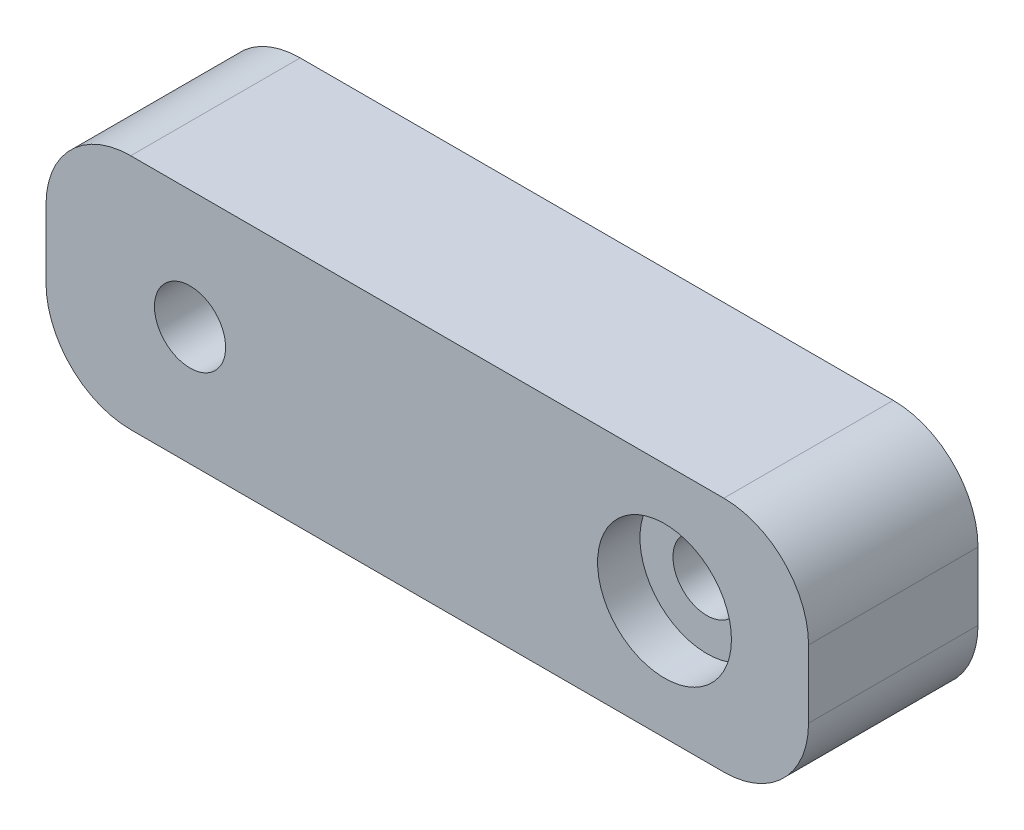
ISO-10303-21;
HEADER;
FILE_DESCRIPTION(('STEP AP214'),'2;1');
FILE_NAME('part.step','',(''),(''),'','','');
FILE_SCHEMA(('AUTOMOTIVE_DESIGN { 1 0 10303 214 1 1 1 1 }'));
ENDSEC;
DATA;
#1=APPLICATION_CONTEXT('core data for automotive mechanical design processes');
#2=APPLICATION_PROTOCOL_DEFINITION('international standard','automotive_design',2000,#1);
#3=PRODUCT_CONTEXT('',#1,'mechanical');
#4=PRODUCT('Part','Part','',(#3));
#5=PRODUCT_RELATED_PRODUCT_CATEGORY('part','',(#4));
#6=PRODUCT_DEFINITION_FORMATION('','',#4);
#7=PRODUCT_DEFINITION_CONTEXT('part definition',#1,'design');
#8=PRODUCT_DEFINITION('design','',#6,#7);
#9=PRODUCT_DEFINITION_SHAPE('','',#8);
#10=(LENGTH_UNIT() NAMED_UNIT(*) SI_UNIT(.MILLI.,.METRE.));
#11=(NAMED_UNIT(*) PLANE_ANGLE_UNIT() SI_UNIT($,.RADIAN.));
#12=(NAMED_UNIT(*) SI_UNIT($,.STERADIAN.) SOLID_ANGLE_UNIT());
#13=UNCERTAINTY_MEASURE_WITH_UNIT(LENGTH_MEASURE(1.E-05),#10,'distance_accuracy_value','');
#14=(GEOMETRIC_REPRESENTATION_CONTEXT(3) GLOBAL_UNCERTAINTY_ASSIGNED_CONTEXT((#13)) GLOBAL_UNIT_ASSIGNED_CONTEXT((#10,
#11,#12)) REPRESENTATION_CONTEXT('',''));
#15=CARTESIAN_POINT('',(0.,0.,0.));
#16=DIRECTION('',(0.,0.,1.));
#17=DIRECTION('',(1.,0.,0.));
#18=AXIS2_PLACEMENT_3D('',#15,#16,#17);
#19=CARTESIAN_POINT('',(-59.3506182432433,20.3019459459459,10.));
#20=DIRECTION('',(1.,0.,0.));
#21=DIRECTION('',(0.,0.,-1.));
#22=AXIS2_PLACEMENT_3D('',#19,#20,#21);
#23=PLANE('',#22);
#24=DIRECTION('',(0.,-1.,0.));
#25=VECTOR('',#24,1.);
#26=CARTESIAN_POINT('',(-59.3506182432433,20.3019459459459,0.));
#27=LINE('',#26,#25);
#28=CARTESIAN_POINT('',(-59.3506182432433,15.3019459459459,0.));
#29=VERTEX_POINT('',#28);
#30=CARTESIAN_POINT('',(-59.3506182432433,11.3019459459459,0.));
#31=VERTEX_POINT('',#30);
#32=EDGE_CURVE('E217',#29,#31,#27,.T.);
#33=ORIENTED_EDGE('',*,*,#32,.T.);
#34=DIRECTION('',(0.,0.,-1.));
#35=VECTOR('',#34,1.);
#36=CARTESIAN_POINT('',(-59.3506182432433,11.3019459459459,10.));
#37=LINE('',#36,#35);
#38=CARTESIAN_POINT('',(-59.3506182432433,11.3019459459459,10.));
#39=VERTEX_POINT('',#38);
#40=EDGE_CURVE('E11',#31,#39,#37,.F.);
#41=ORIENTED_EDGE('',*,*,#40,.T.);
#42=DIRECTION('',(0.,-1.,0.));
#43=VECTOR('',#42,1.);
#44=CARTESIAN_POINT('',(-59.3506182432433,20.3019459459459,10.));
#45=LINE('',#44,#43);
#46=CARTESIAN_POINT('',(-59.3506182432433,15.3019459459459,10.));
#47=VERTEX_POINT('',#46);
#48=EDGE_CURVE('E225',#47,#39,#45,.T.);
#49=ORIENTED_EDGE('',*,*,#48,.F.);
#50=DIRECTION('',(0.,0.,-1.));
#51=VECTOR('',#50,1.);
#52=CARTESIAN_POINT('',(-59.3506182432433,15.3019459459459,0.));
#53=LINE('',#52,#51);
#54=EDGE_CURVE('E234',#47,#29,#53,.T.);
#55=ORIENTED_EDGE('',*,*,#54,.T.);
#56=EDGE_LOOP('',(#33,#41,#49,#55));
#57=FACE_BOUND('',#56,.T.);
#58=ADVANCED_FACE('F43',(#57),#23,.F.);
#59=CARTESIAN_POINT('',(-59.3506182432433,6.30194594594594,10.));
#60=DIRECTION('',(0.,1.,0.));
#61=DIRECTION('',(0.,0.,1.));
#62=AXIS2_PLACEMENT_3D('',#59,#60,#61);
#63=PLANE('',#62);
#64=DIRECTION('',(1.,0.,0.));
#65=VECTOR('',#64,1.);
#66=CARTESIAN_POINT('',(-59.3506182432433,6.30194594594594,0.));
#67=LINE('',#66,#65);
#68=CARTESIAN_POINT('',(-54.3506182432433,6.30194594594594,0.));
#69=VERTEX_POINT('',#68);
#70=CARTESIAN_POINT('',(-19.3506182432433,6.30194594594594,0.));
#71=VERTEX_POINT('',#70);
#72=EDGE_CURVE('E236',#69,#71,#67,.T.);
#73=ORIENTED_EDGE('',*,*,#72,.T.);
#74=DIRECTION('',(0.,0.,-1.));
#75=VECTOR('',#74,1.);
#76=CARTESIAN_POINT('',(-19.3506182432433,6.30194594594594,10.));
#77=LINE('',#76,#75);
#78=CARTESIAN_POINT('',(-19.3506182432433,6.30194594594594,10.));
#79=VERTEX_POINT('',#78);
#80=EDGE_CURVE('E266',#71,#79,#77,.F.);
#81=ORIENTED_EDGE('',*,*,#80,.T.);
#82=DIRECTION('',(1.,0.,0.));
#83=VECTOR('',#82,1.);
#84=CARTESIAN_POINT('',(-59.3506182432433,6.30194594594594,10.));
#85=LINE('',#84,#83);
#86=CARTESIAN_POINT('',(-54.3506182432433,6.30194594594594,10.));
#87=VERTEX_POINT('',#86);
#88=EDGE_CURVE('E222',#87,#79,#85,.T.);
#89=ORIENTED_EDGE('',*,*,#88,.F.);
#90=DIRECTION('',(0.,0.,-1.));
#91=VECTOR('',#90,1.);
#92=CARTESIAN_POINT('',(-54.3506182432433,6.30194594594594,10.));
#93=LINE('',#92,#91);
#94=EDGE_CURVE('E261',#87,#69,#93,.T.);
#95=ORIENTED_EDGE('',*,*,#94,.T.);
#96=EDGE_LOOP('',(#73,#81,#89,#95));
#97=FACE_BOUND('',#96,.T.);
#98=ADVANCED_FACE('F296',(#97),#63,.F.);
#99=CARTESIAN_POINT('',(-14.3506182432433,20.3019459459459,10.));
#100=DIRECTION('',(1.,0.,0.));
#101=DIRECTION('',(0.,0.,-1.));
#102=AXIS2_PLACEMENT_3D('',#99,#100,#101);
#103=PLANE('',#102);
#104=DIRECTION('',(0.,-1.,0.));
#105=VECTOR('',#104,1.);
#106=CARTESIAN_POINT('',(-14.3506182432433,20.3019459459459,10.));
#107=LINE('',#106,#105);
#108=CARTESIAN_POINT('',(-14.3506182432433,15.3019459459459,10.));
#109=VERTEX_POINT('',#108);
#110=CARTESIAN_POINT('',(-14.3506182432433,11.3019459459459,10.));
#111=VERTEX_POINT('',#110);
#112=EDGE_CURVE('E226',#109,#111,#107,.T.);
#113=ORIENTED_EDGE('',*,*,#112,.T.);
#114=DIRECTION('',(0.,0.,-1.));
#115=VECTOR('',#114,1.);
#116=CARTESIAN_POINT('',(-14.3506182432433,11.3019459459459,0.));
#117=LINE('',#116,#115);
#118=CARTESIAN_POINT('',(-14.3506182432433,11.3019459459459,0.));
#119=VERTEX_POINT('',#118);
#120=EDGE_CURVE('E251',#111,#119,#117,.T.);
#121=ORIENTED_EDGE('',*,*,#120,.T.);
#122=DIRECTION('',(0.,-1.,0.));
#123=VECTOR('',#122,1.);
#124=CARTESIAN_POINT('',(-14.3506182432433,20.3019459459459,0.));
#125=LINE('',#124,#123);
#126=CARTESIAN_POINT('',(-14.3506182432433,15.3019459459459,0.));
#127=VERTEX_POINT('',#126);
#128=EDGE_CURVE('E237',#127,#119,#125,.T.);
#129=ORIENTED_EDGE('',*,*,#128,.F.);
#130=DIRECTION('',(0.,0.,-1.));
#131=VECTOR('',#130,1.);
#132=CARTESIAN_POINT('',(-14.3506182432433,15.3019459459459,10.));
#133=LINE('',#132,#131);
#134=EDGE_CURVE('E255',#127,#109,#133,.F.);
#135=ORIENTED_EDGE('',*,*,#134,.T.);
#136=EDGE_LOOP('',(#113,#121,#129,#135));
#137=FACE_BOUND('',#136,.T.);
#138=ADVANCED_FACE('F304',(#137),#103,.T.);
#139=CARTESIAN_POINT('',(-59.3506182432433,20.3019459459459,10.));
#140=DIRECTION('',(0.,1.,0.));
#141=DIRECTION('',(0.,0.,1.));
#142=AXIS2_PLACEMENT_3D('',#139,#140,#141);
#143=PLANE('',#142);
#144=DIRECTION('',(1.,0.,0.));
#145=VECTOR('',#144,1.);
#146=CARTESIAN_POINT('',(-59.3506182432433,20.3019459459459,10.));
#147=LINE('',#146,#145);
#148=CARTESIAN_POINT('',(-54.3506182432433,20.3019459459459,10.));
#149=VERTEX_POINT('',#148);
#150=CARTESIAN_POINT('',(-19.3506182432433,20.3019459459459,10.));
#151=VERTEX_POINT('',#150);
#152=EDGE_CURVE('E233',#149,#151,#147,.T.);
#153=ORIENTED_EDGE('',*,*,#152,.T.);
#154=DIRECTION('',(0.,0.,-1.));
#155=VECTOR('',#154,1.);
#156=CARTESIAN_POINT('',(-19.3506182432433,20.3019459459459,10.));
#157=LINE('',#156,#155);
#158=CARTESIAN_POINT('',(-19.3506182432433,20.3019459459459,0.));
#159=VERTEX_POINT('',#158);
#160=EDGE_CURVE('E51',#151,#159,#157,.T.);
#161=ORIENTED_EDGE('',*,*,#160,.T.);
#162=DIRECTION('',(1.,0.,0.));
#163=VECTOR('',#162,1.);
#164=CARTESIAN_POINT('',(-59.3506182432433,20.3019459459459,0.));
#165=LINE('',#164,#163);
#166=CARTESIAN_POINT('',(-54.3506182432433,20.3019459459459,0.));
#167=VERTEX_POINT('',#166);
#168=EDGE_CURVE('E224',#167,#159,#165,.T.);
#169=ORIENTED_EDGE('',*,*,#168,.F.);
#170=DIRECTION('',(0.,0.,-1.));
#171=VECTOR('',#170,1.);
#172=CARTESIAN_POINT('',(-54.3506182432433,20.3019459459459,10.));
#173=LINE('',#172,#171);
#174=EDGE_CURVE('E247',#167,#149,#173,.F.);
#175=ORIENTED_EDGE('',*,*,#174,.T.);
#176=EDGE_LOOP('',(#153,#161,#169,#175));
#177=FACE_BOUND('',#176,.T.);
#178=ADVANCED_FACE('F276',(#177),#143,.T.);
#179=CARTESIAN_POINT('',(0.,0.,10.));
#180=DIRECTION('',(0.,0.,1.));
#181=DIRECTION('',(1.,0.,0.));
#182=AXIS2_PLACEMENT_3D('',#179,#180,#181);
#183=PLANE('',#182);
#184=CARTESIAN_POINT('',(-50.8506182432433,13.3019459459459,10.));
#185=DIRECTION('',(0.,0.,-1.));
#186=DIRECTION('',(-1.,0.,0.));
#187=AXIS2_PLACEMENT_3D('',#184,#185,#186);
#188=CIRCLE('',#187,2.1);
#189=CARTESIAN_POINT('',(-52.9506182432432,13.3019459459459,10.));
#190=VERTEX_POINT('',#189);
#191=EDGE_CURVE('E207',#190,#190,#188,.T.);
#192=ORIENTED_EDGE('',*,*,#191,.T.);
#193=EDGE_LOOP('',(#192));
#194=FACE_BOUND('',#193,.T.);
#195=CARTESIAN_POINT('',(-22.8506182432433,13.3019459459459,10.));
#196=DIRECTION('',(0.,0.,1.));
#197=DIRECTION('',(1.,0.,0.));
#198=AXIS2_PLACEMENT_3D('',#195,#196,#197);
#199=CIRCLE('',#198,3.95);
#200=CARTESIAN_POINT('',(-18.9006182432433,13.3019459459459,10.));
#201=VERTEX_POINT('',#200);
#202=EDGE_CURVE('E209',#201,#201,#199,.T.);
#203=ORIENTED_EDGE('',*,*,#202,.F.);
#204=EDGE_LOOP('',(#203));
#205=FACE_BOUND('',#204,.T.);
#206=ORIENTED_EDGE('',*,*,#88,.T.);
#207=CARTESIAN_POINT('',(-19.3506182432433,11.3019459459459,10.));
#208=DIRECTION('',(0.,0.,1.));
#209=DIRECTION('',(1.,0.,0.));
#210=AXIS2_PLACEMENT_3D('',#207,#208,#209);
#211=CIRCLE('',#210,5.);
#212=EDGE_CURVE('E275',#79,#111,#211,.T.);
#213=ORIENTED_EDGE('',*,*,#212,.T.);
#214=ORIENTED_EDGE('',*,*,#112,.F.);
#215=CARTESIAN_POINT('',(-19.3506182432433,15.3019459459459,10.));
#216=DIRECTION('',(0.,0.,1.));
#217=DIRECTION('',(1.,0.,0.));
#218=AXIS2_PLACEMENT_3D('',#215,#216,#217);
#219=CIRCLE('',#218,5.);
#220=EDGE_CURVE('E269',#109,#151,#219,.T.);
#221=ORIENTED_EDGE('',*,*,#220,.T.);
#222=ORIENTED_EDGE('',*,*,#152,.F.);
#223=CARTESIAN_POINT('',(-54.3506182432433,15.3019459459459,10.));
#224=DIRECTION('',(0.,0.,1.));
#225=DIRECTION('',(1.,0.,0.));
#226=AXIS2_PLACEMENT_3D('',#223,#224,#225);
#227=CIRCLE('',#226,5.);
#228=EDGE_CURVE('E249',#149,#47,#227,.T.);
#229=ORIENTED_EDGE('',*,*,#228,.T.);
#230=ORIENTED_EDGE('',*,*,#48,.T.);
#231=CARTESIAN_POINT('',(-54.3506182432433,11.3019459459459,10.));
#232=DIRECTION('',(0.,0.,1.));
#233=DIRECTION('',(1.,0.,0.));
#234=AXIS2_PLACEMENT_3D('',#231,#232,#233);
#235=CIRCLE('',#234,5.);
#236=EDGE_CURVE('E268',#39,#87,#235,.T.);
#237=ORIENTED_EDGE('',*,*,#236,.T.);
#238=EDGE_LOOP('',(#206,#213,#214,#221,#222,#229,#230,#237));
#239=FACE_BOUND('',#238,.T.);
#240=ADVANCED_FACE('F292',(#194,#205,#239),#183,.T.);
#241=CARTESIAN_POINT('',(0.,0.,0.));
#242=DIRECTION('',(0.,0.,1.));
#243=DIRECTION('',(1.,0.,0.));
#244=AXIS2_PLACEMENT_3D('',#241,#242,#243);
#245=PLANE('',#244);
#246=DIRECTION('',(0.866025403784448,-0.499999999999983,0.));
#247=VECTOR('',#246,1.);
#248=CARTESIAN_POINT('',(-22.8506182432434,17.3433978302733,0.));
#249=LINE('',#248,#247);
#250=CARTESIAN_POINT('',(-22.8506182432434,17.3433978302733,0.));
#251=VERTEX_POINT('',#250);
#252=CARTESIAN_POINT('',(-19.3506182432433,15.3226718881097,0.));
#253=VERTEX_POINT('',#252);
#254=EDGE_CURVE('E181',#251,#253,#249,.T.);
#255=ORIENTED_EDGE('',*,*,#254,.F.);
#256=DIRECTION('',(0.866025403784448,0.499999999999983,0.));
#257=VECTOR('',#256,1.);
#258=CARTESIAN_POINT('',(-22.8506182432434,17.3433978302733,0.));
#259=LINE('',#258,#257);
#260=CARTESIAN_POINT('',(-26.3506182432435,15.3226718881097,0.));
#261=VERTEX_POINT('',#260);
#262=EDGE_CURVE('E59',#261,#251,#259,.T.);
#263=ORIENTED_EDGE('',*,*,#262,.F.);
#264=DIRECTION('',(0.,1.,0.));
#265=VECTOR('',#264,1.);
#266=CARTESIAN_POINT('',(-26.3506182432435,15.3226718881097,0.));
#267=LINE('',#266,#265);
#268=CARTESIAN_POINT('',(-26.3506182432435,11.2812200037822,0.));
#269=VERTEX_POINT('',#268);
#270=EDGE_CURVE('E164',#269,#261,#267,.T.);
#271=ORIENTED_EDGE('',*,*,#270,.F.);
#272=DIRECTION('',(-0.866025403784448,0.499999999999983,0.));
#273=VECTOR('',#272,1.);
#274=CARTESIAN_POINT('',(-26.3506182432435,11.2812200037822,0.));
#275=LINE('',#274,#273);
#276=CARTESIAN_POINT('',(-22.8506182432434,9.26049406161853,0.));
#277=VERTEX_POINT('',#276);
#278=EDGE_CURVE('E166',#277,#269,#275,.T.);
#279=ORIENTED_EDGE('',*,*,#278,.F.);
#280=DIRECTION('',(-0.866025403784448,-0.499999999999983,0.));
#281=VECTOR('',#280,1.);
#282=CARTESIAN_POINT('',(-19.3506182432433,11.2812200037822,0.));
#283=LINE('',#282,#281);
#284=CARTESIAN_POINT('',(-19.3506182432433,11.2812200037822,0.));
#285=VERTEX_POINT('',#284);
#286=EDGE_CURVE('E187',#285,#277,#283,.T.);
#287=ORIENTED_EDGE('',*,*,#286,.F.);
#288=DIRECTION('',(0.,-1.,0.));
#289=VECTOR('',#288,1.);
#290=CARTESIAN_POINT('',(-19.3506182432433,15.3226718881097,0.));
#291=LINE('',#290,#289);
#292=EDGE_CURVE('E182',#253,#285,#291,.T.);
#293=ORIENTED_EDGE('',*,*,#292,.F.);
#294=EDGE_LOOP('',(#255,#263,#271,#279,#287,#293));
#295=FACE_BOUND('',#294,.T.);
#296=CARTESIAN_POINT('',(-50.8506182432433,13.3019459459459,0.));
#297=DIRECTION('',(0.,0.,-1.));
#298=DIRECTION('',(-1.,0.,0.));
#299=AXIS2_PLACEMENT_3D('',#296,#297,#298);
#300=CIRCLE('',#299,4.);
#301=CARTESIAN_POINT('',(-54.8506182432432,13.3019459459459,0.));
#302=VERTEX_POINT('',#301);
#303=EDGE_CURVE('E212',#302,#302,#300,.T.);
#304=ORIENTED_EDGE('',*,*,#303,.F.);
#305=EDGE_LOOP('',(#304));
#306=FACE_BOUND('',#305,.T.);
#307=ORIENTED_EDGE('',*,*,#128,.T.);
#308=CARTESIAN_POINT('',(-19.3506182432433,11.3019459459459,0.));
#309=DIRECTION('',(0.,0.,1.));
#310=DIRECTION('',(1.,0.,0.));
#311=AXIS2_PLACEMENT_3D('',#308,#309,#310);
#312=CIRCLE('',#311,5.);
#313=EDGE_CURVE('E263',#119,#71,#312,.F.);
#314=ORIENTED_EDGE('',*,*,#313,.T.);
#315=ORIENTED_EDGE('',*,*,#72,.F.);
#316=CARTESIAN_POINT('',(-54.3506182432433,11.3019459459459,0.));
#317=DIRECTION('',(0.,0.,1.));
#318=DIRECTION('',(1.,0.,0.));
#319=AXIS2_PLACEMENT_3D('',#316,#317,#318);
#320=CIRCLE('',#319,5.);
#321=EDGE_CURVE('E256',#69,#31,#320,.F.);
#322=ORIENTED_EDGE('',*,*,#321,.T.);
#323=ORIENTED_EDGE('',*,*,#32,.F.);
#324=CARTESIAN_POINT('',(-54.3506182432433,15.3019459459459,0.));
#325=DIRECTION('',(0.,0.,1.));
#326=DIRECTION('',(1.,0.,0.));
#327=AXIS2_PLACEMENT_3D('',#324,#325,#326);
#328=CIRCLE('',#327,5.);
#329=EDGE_CURVE('E246',#29,#167,#328,.F.);
#330=ORIENTED_EDGE('',*,*,#329,.T.);
#331=ORIENTED_EDGE('',*,*,#168,.T.);
#332=CARTESIAN_POINT('',(-19.3506182432433,15.3019459459459,0.));
#333=DIRECTION('',(0.,0.,1.));
#334=DIRECTION('',(1.,0.,0.));
#335=AXIS2_PLACEMENT_3D('',#332,#333,#334);
#336=CIRCLE('',#335,5.);
#337=EDGE_CURVE('E258',#159,#127,#336,.F.);
#338=ORIENTED_EDGE('',*,*,#337,.T.);
#339=EDGE_LOOP('',(#307,#314,#315,#322,#323,#330,#331,#338));
#340=FACE_BOUND('',#339,.T.);
#341=ADVANCED_FACE('F281',(#295,#306,#340),#245,.F.);
#342=CARTESIAN_POINT('',(-54.3506182432433,15.3019459459459,10.));
#343=DIRECTION('',(0.,0.,1.));
#344=DIRECTION('',(1.,0.,0.));
#345=AXIS2_PLACEMENT_3D('',#342,#343,#344);
#346=CYLINDRICAL_SURFACE('',#345,5.);
#347=ORIENTED_EDGE('',*,*,#228,.F.);
#348=ORIENTED_EDGE('',*,*,#174,.F.);
#349=ORIENTED_EDGE('',*,*,#329,.F.);
#350=ORIENTED_EDGE('',*,*,#54,.F.);
#351=EDGE_LOOP('',(#347,#348,#349,#350));
#352=FACE_BOUND('',#351,.T.);
#353=ADVANCED_FACE('F287',(#352),#346,.T.);
#354=CARTESIAN_POINT('',(-19.3506182432433,11.3019459459459,10.));
#355=DIRECTION('',(0.,0.,1.));
#356=DIRECTION('',(1.,0.,0.));
#357=AXIS2_PLACEMENT_3D('',#354,#355,#356);
#358=CYLINDRICAL_SURFACE('',#357,5.);
#359=ORIENTED_EDGE('',*,*,#212,.F.);
#360=ORIENTED_EDGE('',*,*,#80,.F.);
#361=ORIENTED_EDGE('',*,*,#313,.F.);
#362=ORIENTED_EDGE('',*,*,#120,.F.);
#363=EDGE_LOOP('',(#359,#360,#361,#362));
#364=FACE_BOUND('',#363,.T.);
#365=ADVANCED_FACE('F303',(#364),#358,.T.);
#366=CARTESIAN_POINT('',(-19.3506182432433,15.3019459459459,10.));
#367=DIRECTION('',(0.,0.,-1.));
#368=DIRECTION('',(-1.,0.,0.));
#369=AXIS2_PLACEMENT_3D('',#366,#367,#368);
#370=CYLINDRICAL_SURFACE('',#369,5.);
#371=ORIENTED_EDGE('',*,*,#220,.F.);
#372=ORIENTED_EDGE('',*,*,#134,.F.);
#373=ORIENTED_EDGE('',*,*,#337,.F.);
#374=ORIENTED_EDGE('',*,*,#160,.F.);
#375=EDGE_LOOP('',(#371,#372,#373,#374));
#376=FACE_BOUND('',#375,.T.);
#377=ADVANCED_FACE('F308',(#376),#370,.T.);
#378=CARTESIAN_POINT('',(-54.3506182432433,11.3019459459459,10.));
#379=DIRECTION('',(0.,0.,-1.));
#380=DIRECTION('',(-1.,0.,0.));
#381=AXIS2_PLACEMENT_3D('',#378,#379,#380);
#382=CYLINDRICAL_SURFACE('',#381,5.);
#383=ORIENTED_EDGE('',*,*,#236,.F.);
#384=ORIENTED_EDGE('',*,*,#40,.F.);
#385=ORIENTED_EDGE('',*,*,#321,.F.);
#386=ORIENTED_EDGE('',*,*,#94,.F.);
#387=EDGE_LOOP('',(#383,#384,#385,#386));
#388=FACE_BOUND('',#387,.T.);
#389=ADVANCED_FACE('F44',(#388),#382,.T.);
#390=CARTESIAN_POINT('',(-50.8506182432433,13.3019459459459,2.5));
#391=DIRECTION('',(0.,0.,-1.));
#392=DIRECTION('',(-1.,0.,0.));
#393=AXIS2_PLACEMENT_3D('',#390,#391,#392);
#394=CYLINDRICAL_SURFACE('',#393,4.);
#395=CARTESIAN_POINT('',(-50.8506182432433,13.3019459459459,2.5));
#396=DIRECTION('',(0.,0.,-1.));
#397=DIRECTION('',(-1.,0.,0.));
#398=AXIS2_PLACEMENT_3D('',#395,#396,#397);
#399=CIRCLE('',#398,4.);
#400=CARTESIAN_POINT('',(-54.8506182432432,13.3019459459459,2.5));
#401=VERTEX_POINT('',#400);
#402=EDGE_CURVE('E218',#401,#401,#399,.T.);
#403=ORIENTED_EDGE('',*,*,#402,.F.);
#404=EDGE_LOOP('',(#403));
#405=FACE_BOUND('',#404,.T.);
#406=ORIENTED_EDGE('',*,*,#303,.T.);
#407=EDGE_LOOP('',(#406));
#408=FACE_BOUND('',#407,.T.);
#409=ADVANCED_FACE('F313',(#405,#408),#394,.F.);
#410=CARTESIAN_POINT('',(-50.8506182432433,13.3019459459459,2.5));
#411=DIRECTION('',(0.,0.,-1.));
#412=DIRECTION('',(-1.,0.,0.));
#413=AXIS2_PLACEMENT_3D('',#410,#411,#412);
#414=PLANE('',#413);
#415=CARTESIAN_POINT('',(-50.8506182432433,13.3019459459459,2.5));
#416=DIRECTION('',(0.,0.,-1.));
#417=DIRECTION('',(-1.,0.,0.));
#418=AXIS2_PLACEMENT_3D('',#415,#416,#417);
#419=CIRCLE('',#418,2.1);
#420=CARTESIAN_POINT('',(-52.9506182432432,13.3019459459459,2.5));
#421=VERTEX_POINT('',#420);
#422=EDGE_CURVE('E211',#421,#421,#419,.T.);
#423=ORIENTED_EDGE('',*,*,#422,.F.);
#424=EDGE_LOOP('',(#423));
#425=FACE_BOUND('',#424,.T.);
#426=ORIENTED_EDGE('',*,*,#402,.T.);
#427=EDGE_LOOP('',(#426));
#428=FACE_BOUND('',#427,.T.);
#429=ADVANCED_FACE('F379',(#425,#428),#414,.T.);
#430=CARTESIAN_POINT('',(-50.8506182432433,13.3019459459459,4.5));
#431=DIRECTION('',(0.,0.,-1.));
#432=DIRECTION('',(-1.,0.,0.));
#433=AXIS2_PLACEMENT_3D('',#430,#431,#432);
#434=CYLINDRICAL_SURFACE('',#433,2.1);
#435=ORIENTED_EDGE('',*,*,#422,.T.);
#436=EDGE_LOOP('',(#435));
#437=FACE_BOUND('',#436,.T.);
#438=ORIENTED_EDGE('',*,*,#191,.F.);
#439=EDGE_LOOP('',(#438));
#440=FACE_BOUND('',#439,.T.);
#441=ADVANCED_FACE('F388',(#437,#440),#434,.F.);
#442=CARTESIAN_POINT('',(-22.8506182432433,13.3019459459459,5.));
#443=DIRECTION('',(0.,0.,1.));
#444=DIRECTION('',(1.,0.,0.));
#445=AXIS2_PLACEMENT_3D('',#442,#443,#444);
#446=CYLINDRICAL_SURFACE('',#445,3.95);
#447=CARTESIAN_POINT('',(-22.8506182432433,13.3019459459459,7.5));
#448=DIRECTION('',(0.,0.,1.));
#449=DIRECTION('',(1.,0.,0.));
#450=AXIS2_PLACEMENT_3D('',#447,#448,#449);
#451=CIRCLE('',#450,3.95);
#452=CARTESIAN_POINT('',(-18.9006182432433,13.3019459459459,7.5));
#453=VERTEX_POINT('',#452);
#454=EDGE_CURVE('E203',#453,#453,#451,.T.);
#455=ORIENTED_EDGE('',*,*,#454,.F.);
#456=EDGE_LOOP('',(#455));
#457=FACE_BOUND('',#456,.T.);
#458=ORIENTED_EDGE('',*,*,#202,.T.);
#459=EDGE_LOOP('',(#458));
#460=FACE_BOUND('',#459,.T.);
#461=ADVANCED_FACE('F399',(#457,#460),#446,.F.);
#462=CARTESIAN_POINT('',(-22.8506182432433,13.3019459459459,-0.00100000000000013));
#463=DIRECTION('',(0.,0.,1.));
#464=DIRECTION('',(1.,0.,0.));
#465=AXIS2_PLACEMENT_3D('',#462,#463,#464);
#466=CYLINDRICAL_SURFACE('',#465,2.);
#467=CARTESIAN_POINT('',(-22.8506182432433,13.3019459459459,3.));
#468=DIRECTION('',(0.,0.,-1.));
#469=DIRECTION('',(-1.,0.,0.));
#470=AXIS2_PLACEMENT_3D('',#467,#468,#469);
#471=CIRCLE('',#470,2.);
#472=CARTESIAN_POINT('',(-24.8506182432433,13.3019459459459,3.));
#473=VERTEX_POINT('',#472);
#474=EDGE_CURVE('E171',#473,#473,#471,.T.);
#475=ORIENTED_EDGE('',*,*,#474,.T.);
#476=EDGE_LOOP('',(#475));
#477=FACE_BOUND('',#476,.T.);
#478=CARTESIAN_POINT('',(-22.8506182432433,13.3019459459459,7.5));
#479=DIRECTION('',(0.,0.,1.));
#480=DIRECTION('',(1.,0.,0.));
#481=AXIS2_PLACEMENT_3D('',#478,#479,#480);
#482=CIRCLE('',#481,2.);
#483=CARTESIAN_POINT('',(-20.8506182432433,13.3019459459459,7.5));
#484=VERTEX_POINT('',#483);
#485=EDGE_CURVE('E195',#484,#484,#482,.T.);
#486=ORIENTED_EDGE('',*,*,#485,.T.);
#487=EDGE_LOOP('',(#486));
#488=FACE_BOUND('',#487,.T.);
#489=ADVANCED_FACE('F415',(#477,#488),#466,.F.);
#490=CARTESIAN_POINT('',(-22.8506182432433,13.3019459459459,7.5));
#491=DIRECTION('',(0.,0.,1.));
#492=DIRECTION('',(1.,0.,0.));
#493=AXIS2_PLACEMENT_3D('',#490,#491,#492);
#494=PLANE('',#493);
#495=ORIENTED_EDGE('',*,*,#454,.T.);
#496=EDGE_LOOP('',(#495));
#497=FACE_BOUND('',#496,.T.);
#498=ORIENTED_EDGE('',*,*,#485,.F.);
#499=EDGE_LOOP('',(#498));
#500=FACE_BOUND('',#499,.T.);
#501=ADVANCED_FACE('F419',(#497,#500),#494,.T.);
#502=CARTESIAN_POINT('',(-22.8506182432434,17.3433978302733,3.));
#503=DIRECTION('',(-0.499999999999983,0.866025403784448,0.));
#504=DIRECTION('',(-0.866025403784448,-0.499999999999983,0.));
#505=AXIS2_PLACEMENT_3D('',#502,#503,#504);
#506=PLANE('',#505);
#507=ORIENTED_EDGE('',*,*,#262,.T.);
#508=DIRECTION('',(0.,0.,-1.));
#509=VECTOR('',#508,1.);
#510=CARTESIAN_POINT('',(-22.8506182432434,17.3433978302733,3.));
#511=LINE('',#510,#509);
#512=CARTESIAN_POINT('',(-22.8506182432434,17.3433978302733,3.));
#513=VERTEX_POINT('',#512);
#514=EDGE_CURVE('E145',#513,#251,#511,.T.);
#515=ORIENTED_EDGE('',*,*,#514,.F.);
#516=DIRECTION('',(0.866025403784448,0.499999999999983,0.));
#517=VECTOR('',#516,1.);
#518=CARTESIAN_POINT('',(-22.8506182432434,17.3433978302733,3.));
#519=LINE('',#518,#517);
#520=CARTESIAN_POINT('',(-26.3506182432435,15.3226718881097,3.));
#521=VERTEX_POINT('',#520);
#522=EDGE_CURVE('E149',#521,#513,#519,.T.);
#523=ORIENTED_EDGE('',*,*,#522,.F.);
#524=DIRECTION('',(0.,0.,-1.));
#525=VECTOR('',#524,1.);
#526=CARTESIAN_POINT('',(-26.3506182432435,15.3226718881097,3.));
#527=LINE('',#526,#525);
#528=EDGE_CURVE('E194',#521,#261,#527,.T.);
#529=ORIENTED_EDGE('',*,*,#528,.T.);
#530=EDGE_LOOP('',(#507,#515,#523,#529));
#531=FACE_BOUND('',#530,.T.);
#532=ADVANCED_FACE('F144',(#531),#506,.F.);
#533=CARTESIAN_POINT('',(-26.3506182432435,15.3226718881097,3.));
#534=DIRECTION('',(-1.,0.,0.));
#535=DIRECTION('',(0.,0.,1.));
#536=AXIS2_PLACEMENT_3D('',#533,#534,#535);
#537=PLANE('',#536);
#538=ORIENTED_EDGE('',*,*,#270,.T.);
#539=ORIENTED_EDGE('',*,*,#528,.F.);
#540=DIRECTION('',(0.,1.,0.));
#541=VECTOR('',#540,1.);
#542=CARTESIAN_POINT('',(-26.3506182432435,15.3226718881097,3.));
#543=LINE('',#542,#541);
#544=CARTESIAN_POINT('',(-26.3506182432435,11.2812200037822,3.));
#545=VERTEX_POINT('',#544);
#546=EDGE_CURVE('E155',#545,#521,#543,.T.);
#547=ORIENTED_EDGE('',*,*,#546,.F.);
#548=DIRECTION('',(0.,0.,-1.));
#549=VECTOR('',#548,1.);
#550=CARTESIAN_POINT('',(-26.3506182432435,11.2812200037822,3.));
#551=LINE('',#550,#549);
#552=EDGE_CURVE('E193',#545,#269,#551,.T.);
#553=ORIENTED_EDGE('',*,*,#552,.T.);
#554=EDGE_LOOP('',(#538,#539,#547,#553));
#555=FACE_BOUND('',#554,.T.);
#556=ADVANCED_FACE('F441',(#555),#537,.F.);
#557=CARTESIAN_POINT('',(-26.3506182432435,11.2812200037822,3.));
#558=DIRECTION('',(-0.499999999999983,-0.866025403784448,0.));
#559=DIRECTION('',(0.866025403784448,-0.499999999999983,0.));
#560=AXIS2_PLACEMENT_3D('',#557,#558,#559);
#561=PLANE('',#560);
#562=ORIENTED_EDGE('',*,*,#278,.T.);
#563=ORIENTED_EDGE('',*,*,#552,.F.);
#564=DIRECTION('',(-0.866025403784448,0.499999999999983,0.));
#565=VECTOR('',#564,1.);
#566=CARTESIAN_POINT('',(-26.3506182432435,11.2812200037822,3.));
#567=LINE('',#566,#565);
#568=CARTESIAN_POINT('',(-22.8506182432434,9.26049406161853,3.));
#569=VERTEX_POINT('',#568);
#570=EDGE_CURVE('E180',#569,#545,#567,.T.);
#571=ORIENTED_EDGE('',*,*,#570,.F.);
#572=DIRECTION('',(0.,0.,-1.));
#573=VECTOR('',#572,1.);
#574=CARTESIAN_POINT('',(-22.8506182432434,9.26049406161853,3.));
#575=LINE('',#574,#573);
#576=EDGE_CURVE('E198',#569,#277,#575,.T.);
#577=ORIENTED_EDGE('',*,*,#576,.T.);
#578=EDGE_LOOP('',(#562,#563,#571,#577));
#579=FACE_BOUND('',#578,.T.);
#580=ADVANCED_FACE('F448',(#579),#561,.F.);
#581=CARTESIAN_POINT('',(-19.3506182432433,11.2812200037822,3.));
#582=DIRECTION('',(0.499999999999983,-0.866025403784448,0.));
#583=DIRECTION('',(0.866025403784448,0.499999999999983,0.));
#584=AXIS2_PLACEMENT_3D('',#581,#582,#583);
#585=PLANE('',#584);
#586=ORIENTED_EDGE('',*,*,#286,.T.);
#587=ORIENTED_EDGE('',*,*,#576,.F.);
#588=DIRECTION('',(-0.866025403784448,-0.499999999999983,0.));
#589=VECTOR('',#588,1.);
#590=CARTESIAN_POINT('',(-19.3506182432433,11.2812200037822,3.));
#591=LINE('',#590,#589);
#592=CARTESIAN_POINT('',(-19.3506182432433,11.2812200037822,3.));
#593=VERTEX_POINT('',#592);
#594=EDGE_CURVE('E172',#593,#569,#591,.T.);
#595=ORIENTED_EDGE('',*,*,#594,.F.);
#596=DIRECTION('',(0.,0.,-1.));
#597=VECTOR('',#596,1.);
#598=CARTESIAN_POINT('',(-19.3506182432433,11.2812200037822,3.));
#599=LINE('',#598,#597);
#600=EDGE_CURVE('E196',#593,#285,#599,.T.);
#601=ORIENTED_EDGE('',*,*,#600,.T.);
#602=EDGE_LOOP('',(#586,#587,#595,#601));
#603=FACE_BOUND('',#602,.T.);
#604=ADVANCED_FACE('F459',(#603),#585,.F.);
#605=CARTESIAN_POINT('',(-19.3506182432433,15.3226718881097,3.));
#606=DIRECTION('',(1.,0.,0.));
#607=DIRECTION('',(0.,0.,-1.));
#608=AXIS2_PLACEMENT_3D('',#605,#606,#607);
#609=PLANE('',#608);
#610=ORIENTED_EDGE('',*,*,#292,.T.);
#611=ORIENTED_EDGE('',*,*,#600,.F.);
#612=DIRECTION('',(0.,-1.,0.));
#613=VECTOR('',#612,1.);
#614=CARTESIAN_POINT('',(-19.3506182432433,15.3226718881097,3.));
#615=LINE('',#614,#613);
#616=CARTESIAN_POINT('',(-19.3506182432433,15.3226718881097,3.));
#617=VERTEX_POINT('',#616);
#618=EDGE_CURVE('E159',#617,#593,#615,.T.);
#619=ORIENTED_EDGE('',*,*,#618,.F.);
#620=DIRECTION('',(0.,0.,-1.));
#621=VECTOR('',#620,1.);
#622=CARTESIAN_POINT('',(-19.3506182432433,15.3226718881097,3.));
#623=LINE('',#622,#621);
#624=EDGE_CURVE('E153',#617,#253,#623,.T.);
#625=ORIENTED_EDGE('',*,*,#624,.T.);
#626=EDGE_LOOP('',(#610,#611,#619,#625));
#627=FACE_BOUND('',#626,.T.);
#628=ADVANCED_FACE('F468',(#627),#609,.F.);
#629=CARTESIAN_POINT('',(-22.8506182432434,17.3433978302733,3.));
#630=DIRECTION('',(0.499999999999983,0.866025403784448,0.));
#631=DIRECTION('',(-0.866025403784448,0.499999999999983,0.));
#632=AXIS2_PLACEMENT_3D('',#629,#630,#631);
#633=PLANE('',#632);
#634=ORIENTED_EDGE('',*,*,#254,.T.);
#635=ORIENTED_EDGE('',*,*,#624,.F.);
#636=DIRECTION('',(0.866025403784448,-0.499999999999983,0.));
#637=VECTOR('',#636,1.);
#638=CARTESIAN_POINT('',(-22.8506182432434,17.3433978302733,3.));
#639=LINE('',#638,#637);
#640=EDGE_CURVE('E154',#513,#617,#639,.T.);
#641=ORIENTED_EDGE('',*,*,#640,.F.);
#642=ORIENTED_EDGE('',*,*,#514,.T.);
#643=EDGE_LOOP('',(#634,#635,#641,#642));
#644=FACE_BOUND('',#643,.T.);
#645=ADVANCED_FACE('F156',(#644),#633,.F.);
#646=CARTESIAN_POINT('',(0.,0.,3.));
#647=DIRECTION('',(0.,0.,1.));
#648=DIRECTION('',(1.,0.,0.));
#649=AXIS2_PLACEMENT_3D('',#646,#647,#648);
#650=PLANE('',#649);
#651=ORIENTED_EDGE('',*,*,#474,.F.);
#652=EDGE_LOOP('',(#651));
#653=FACE_BOUND('',#652,.T.);
#654=ORIENTED_EDGE('',*,*,#522,.T.);
#655=ORIENTED_EDGE('',*,*,#640,.T.);
#656=ORIENTED_EDGE('',*,*,#618,.T.);
#657=ORIENTED_EDGE('',*,*,#594,.T.);
#658=ORIENTED_EDGE('',*,*,#570,.T.);
#659=ORIENTED_EDGE('',*,*,#546,.T.);
#660=EDGE_LOOP('',(#654,#655,#656,#657,#658,#659));
#661=FACE_BOUND('',#660,.T.);
#662=ADVANCED_FACE('F162',(#653,#661),#650,.F.);
#663=CLOSED_SHELL('',(#58,#98,#138,#178,#240,#341,#353,#365,#377,#389,#409,#429,#441,#461,#489,
#501,#532,#556,#580,#604,#628,#645,#662));
#664=MANIFOLD_SOLID_BREP('B2',#663);
#665=ADVANCED_BREP_SHAPE_REPRESENTATION('',(#18,#664),#14);
#666=SHAPE_DEFINITION_REPRESENTATION(#9,#665);
ENDSEC;
END-ISO-10303-21;
